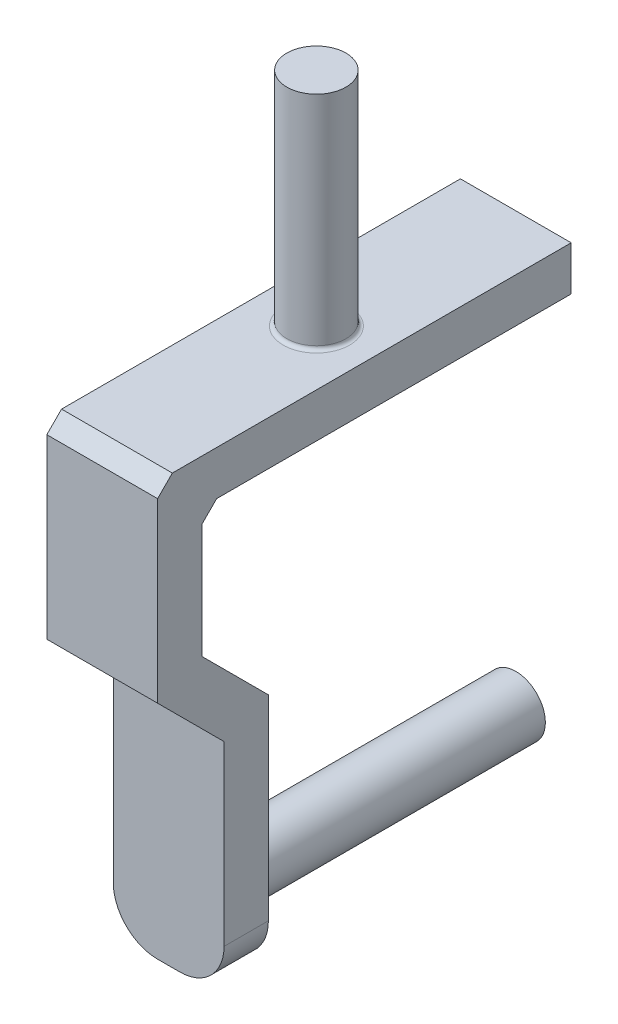
ISO-10303-21;
HEADER;
FILE_DESCRIPTION(('STEP AP214'),'2;1');
FILE_NAME('part.step','',(''),(''),'','','');
FILE_SCHEMA(('AUTOMOTIVE_DESIGN { 1 0 10303 214 1 1 1 1 }'));
ENDSEC;
DATA;
#1=APPLICATION_CONTEXT('core data for automotive mechanical design processes');
#2=APPLICATION_PROTOCOL_DEFINITION('international standard','automotive_design',2000,#1);
#3=PRODUCT_CONTEXT('',#1,'mechanical');
#4=PRODUCT('Part','Part','',(#3));
#5=PRODUCT_RELATED_PRODUCT_CATEGORY('part','',(#4));
#6=PRODUCT_DEFINITION_FORMATION('','',#4);
#7=PRODUCT_DEFINITION_CONTEXT('part definition',#1,'design');
#8=PRODUCT_DEFINITION('design','',#6,#7);
#9=PRODUCT_DEFINITION_SHAPE('','',#8);
#10=(LENGTH_UNIT() NAMED_UNIT(*) SI_UNIT(.MILLI.,.METRE.));
#11=(NAMED_UNIT(*) PLANE_ANGLE_UNIT() SI_UNIT($,.RADIAN.));
#12=(NAMED_UNIT(*) SI_UNIT($,.STERADIAN.) SOLID_ANGLE_UNIT());
#13=UNCERTAINTY_MEASURE_WITH_UNIT(LENGTH_MEASURE(1.E-05),#10,'distance_accuracy_value','');
#14=(GEOMETRIC_REPRESENTATION_CONTEXT(3) GLOBAL_UNCERTAINTY_ASSIGNED_CONTEXT((#13)) GLOBAL_UNIT_ASSIGNED_CONTEXT((#10,
#11,#12)) REPRESENTATION_CONTEXT('',''));
#15=CARTESIAN_POINT('',(0.,0.,0.));
#16=DIRECTION('',(0.,0.,1.));
#17=DIRECTION('',(1.,0.,0.));
#18=AXIS2_PLACEMENT_3D('',#15,#16,#17);
#19=CARTESIAN_POINT('',(-7.5,32.5,6.));
#20=DIRECTION('',(0.,-1.,0.));
#21=DIRECTION('',(0.,0.,-1.));
#22=AXIS2_PLACEMENT_3D('',#19,#20,#21);
#23=PLANE('',#22);
#24=CARTESIAN_POINT('',(0.,32.5,-23.));
#25=DIRECTION('',(0.,-1.,0.));
#26=DIRECTION('',(0.,0.,-1.));
#27=AXIS2_PLACEMENT_3D('',#24,#25,#26);
#28=CIRCLE('',#27,4.5);
#29=CARTESIAN_POINT('',(0.,32.5,-27.5));
#30=VERTEX_POINT('',#29);
#31=EDGE_CURVE('E249',#30,#30,#28,.T.);
#32=ORIENTED_EDGE('',*,*,#31,.T.);
#33=EDGE_LOOP('',(#32));
#34=FACE_BOUND('',#33,.T.);
#35=DIRECTION('',(0.,0.,-1.));
#36=VECTOR('',#35,1.);
#37=CARTESIAN_POINT('',(-7.5,32.5,6.));
#38=LINE('',#37,#36);
#39=CARTESIAN_POINT('',(-7.5,32.5,3.99999999999999));
#40=VERTEX_POINT('',#39);
#41=CARTESIAN_POINT('',(-7.5,32.5,-50.));
#42=VERTEX_POINT('',#41);
#43=EDGE_CURVE('E208',#40,#42,#38,.T.);
#44=ORIENTED_EDGE('',*,*,#43,.F.);
#45=DIRECTION('',(1.,0.,0.));
#46=VECTOR('',#45,1.);
#47=CARTESIAN_POINT('',(7.5,32.5,3.99999999999999));
#48=LINE('',#47,#46);
#49=CARTESIAN_POINT('',(7.5,32.5,3.99999999999999));
#50=VERTEX_POINT('',#49);
#51=EDGE_CURVE('E223',#40,#50,#48,.T.);
#52=ORIENTED_EDGE('',*,*,#51,.T.);
#53=DIRECTION('',(0.,0.,-1.));
#54=VECTOR('',#53,1.);
#55=CARTESIAN_POINT('',(7.5,32.5,6.));
#56=LINE('',#55,#54);
#57=CARTESIAN_POINT('',(7.5,32.5,-50.));
#58=VERTEX_POINT('',#57);
#59=EDGE_CURVE('E304',#50,#58,#56,.T.);
#60=ORIENTED_EDGE('',*,*,#59,.T.);
#61=DIRECTION('',(1.,0.,0.));
#62=VECTOR('',#61,1.);
#63=CARTESIAN_POINT('',(-7.5,32.5,-50.));
#64=LINE('',#63,#62);
#65=EDGE_CURVE('E195',#42,#58,#64,.T.);
#66=ORIENTED_EDGE('',*,*,#65,.F.);
#67=EDGE_LOOP('',(#44,#52,#60,#66));
#68=FACE_BOUND('',#67,.T.);
#69=ADVANCED_FACE('F35',(#34,#68),#23,.F.);
#70=CARTESIAN_POINT('',(-7.5,-32.5,0.));
#71=DIRECTION('',(0.,0.,1.));
#72=DIRECTION('',(1.,0.,0.));
#73=AXIS2_PLACEMENT_3D('',#70,#71,#72);
#74=PLANE('',#73);
#75=DIRECTION('',(0.,1.,0.));
#76=VECTOR('',#75,1.);
#77=CARTESIAN_POINT('',(7.5,32.5,0.));
#78=LINE('',#77,#76);
#79=CARTESIAN_POINT('',(7.5,9.00000000000006,0.));
#80=VERTEX_POINT('',#79);
#81=CARTESIAN_POINT('',(7.5,24.5,0.));
#82=VERTEX_POINT('',#81);
#83=EDGE_CURVE('E206',#80,#82,#78,.T.);
#84=ORIENTED_EDGE('',*,*,#83,.F.);
#85=DIRECTION('',(-1.,0.,0.));
#86=VECTOR('',#85,1.);
#87=CARTESIAN_POINT('',(-7.49999999999998,9.00000000000007,0.));
#88=LINE('',#87,#86);
#89=CARTESIAN_POINT('',(-7.5,9.00000000000007,0.));
#90=VERTEX_POINT('',#89);
#91=EDGE_CURVE('E252',#80,#90,#88,.T.);
#92=ORIENTED_EDGE('',*,*,#91,.T.);
#93=DIRECTION('',(0.,-1.,0.));
#94=VECTOR('',#93,1.);
#95=CARTESIAN_POINT('',(-7.5,32.5,0.));
#96=LINE('',#95,#94);
#97=CARTESIAN_POINT('',(-7.5,24.5,0.));
#98=VERTEX_POINT('',#97);
#99=EDGE_CURVE('E214',#98,#90,#96,.T.);
#100=ORIENTED_EDGE('',*,*,#99,.F.);
#101=DIRECTION('',(1.,0.,0.));
#102=VECTOR('',#101,1.);
#103=CARTESIAN_POINT('',(7.5,24.5,0.));
#104=LINE('',#103,#102);
#105=EDGE_CURVE('E231',#98,#82,#104,.T.);
#106=ORIENTED_EDGE('',*,*,#105,.T.);
#107=EDGE_LOOP('',(#84,#92,#100,#106));
#108=FACE_BOUND('',#107,.T.);
#109=ADVANCED_FACE('F282',(#108),#74,.F.);
#110=CARTESIAN_POINT('',(-7.5,32.5,6.));
#111=DIRECTION('',(1.,0.,0.));
#112=DIRECTION('',(0.,1.,0.));
#113=AXIS2_PLACEMENT_3D('',#110,#111,#112);
#114=PLANE('',#113);
#115=DIRECTION('',(0.,1.,0.));
#116=VECTOR('',#115,1.);
#117=CARTESIAN_POINT('',(-7.5,-2.48528137423857,-3.));
#118=LINE('',#117,#116);
#119=CARTESIAN_POINT('',(-7.5,-26.5,-3.));
#120=VERTEX_POINT('',#119);
#121=CARTESIAN_POINT('',(-7.5,-2.48528137423857,-3.));
#122=VERTEX_POINT('',#121);
#123=EDGE_CURVE('E139',#120,#122,#118,.T.);
#124=ORIENTED_EDGE('',*,*,#123,.T.);
#125=DIRECTION('',(0.,0.707106781186548,0.707106781186547));
#126=VECTOR('',#125,1.);
#127=CARTESIAN_POINT('',(-7.5,6.51471862576143,6.));
#128=LINE('',#127,#126);
#129=CARTESIAN_POINT('',(-7.5,6.51471862576143,6.));
#130=VERTEX_POINT('',#129);
#131=EDGE_CURVE('E148',#122,#130,#128,.T.);
#132=ORIENTED_EDGE('',*,*,#131,.T.);
#133=DIRECTION('',(0.,-1.,0.));
#134=VECTOR('',#133,1.);
#135=CARTESIAN_POINT('',(-7.5,32.5,6.));
#136=LINE('',#135,#134);
#137=CARTESIAN_POINT('',(-7.5,30.5,6.));
#138=VERTEX_POINT('',#137);
#139=EDGE_CURVE('E203',#138,#130,#136,.T.);
#140=ORIENTED_EDGE('',*,*,#139,.F.);
#141=DIRECTION('',(0.,0.707106781186546,-0.707106781186549));
#142=VECTOR('',#141,1.);
#143=CARTESIAN_POINT('',(-7.5,30.5,6.));
#144=LINE('',#143,#142);
#145=EDGE_CURVE('E221',#138,#40,#144,.T.);
#146=ORIENTED_EDGE('',*,*,#145,.T.);
#147=ORIENTED_EDGE('',*,*,#43,.T.);
#148=DIRECTION('',(0.,1.,0.));
#149=VECTOR('',#148,1.);
#150=CARTESIAN_POINT('',(-7.5,32.5,-50.));
#151=LINE('',#150,#149);
#152=CARTESIAN_POINT('',(-7.50000000000001,26.5,-50.));
#153=VERTEX_POINT('',#152);
#154=EDGE_CURVE('E192',#153,#42,#151,.T.);
#155=ORIENTED_EDGE('',*,*,#154,.F.);
#156=DIRECTION('',(0.,0.,1.));
#157=VECTOR('',#156,1.);
#158=CARTESIAN_POINT('',(-7.50000000000001,26.5,-50.));
#159=LINE('',#158,#157);
#160=CARTESIAN_POINT('',(-7.50000000000001,26.5,-2.00000000000002));
#161=VERTEX_POINT('',#160);
#162=EDGE_CURVE('E202',#153,#161,#159,.T.);
#163=ORIENTED_EDGE('',*,*,#162,.T.);
#164=DIRECTION('',(0.,0.707106781186544,-0.707106781186551));
#165=VECTOR('',#164,1.);
#166=CARTESIAN_POINT('',(-7.5,25.4999999999999,-0.999999999999966));
#167=LINE('',#166,#165);
#168=EDGE_CURVE('E234',#161,#98,#167,.F.);
#169=ORIENTED_EDGE('',*,*,#168,.T.);
#170=ORIENTED_EDGE('',*,*,#99,.T.);
#171=DIRECTION('',(0.,-0.707106781186552,-0.707106781186543));
#172=VECTOR('',#171,1.);
#173=CARTESIAN_POINT('',(-7.5,23.7500000000002,14.7499999999999));
#174=LINE('',#173,#172);
#175=CARTESIAN_POINT('',(-7.5,0.,-9.));
#176=VERTEX_POINT('',#175);
#177=EDGE_CURVE('E256',#90,#176,#174,.T.);
#178=ORIENTED_EDGE('',*,*,#177,.T.);
#179=DIRECTION('',(0.,-1.,0.));
#180=VECTOR('',#179,1.);
#181=CARTESIAN_POINT('',(-7.5,0.,-9.));
#182=LINE('',#181,#180);
#183=CARTESIAN_POINT('',(-7.5,-26.5,-9.));
#184=VERTEX_POINT('',#183);
#185=EDGE_CURVE('E184',#176,#184,#182,.T.);
#186=ORIENTED_EDGE('',*,*,#185,.T.);
#187=DIRECTION('',(0.,0.,-1.));
#188=VECTOR('',#187,1.);
#189=CARTESIAN_POINT('',(-7.5,-26.5,6.));
#190=LINE('',#189,#188);
#191=EDGE_CURVE('E158',#184,#120,#190,.F.);
#192=ORIENTED_EDGE('',*,*,#191,.T.);
#193=EDGE_LOOP('',(#124,#132,#140,#146,#147,#155,#163,#169,#170,#178,#186,#192));
#194=FACE_BOUND('',#193,.T.);
#195=ADVANCED_FACE('F156',(#194),#114,.F.);
#196=CARTESIAN_POINT('',(-7.5,-32.5,6.));
#197=DIRECTION('',(0.,1.,0.));
#198=DIRECTION('',(0.,0.,1.));
#199=AXIS2_PLACEMENT_3D('',#196,#197,#198);
#200=PLANE('',#199);
#201=DIRECTION('',(0.,0.,-1.));
#202=VECTOR('',#201,1.);
#203=CARTESIAN_POINT('',(1.5,-32.5,6.));
#204=LINE('',#203,#202);
#205=CARTESIAN_POINT('',(1.5,-32.5,-9.));
#206=VERTEX_POINT('',#205);
#207=CARTESIAN_POINT('',(1.5,-32.5,-3.));
#208=VERTEX_POINT('',#207);
#209=EDGE_CURVE('E238',#206,#208,#204,.F.);
#210=ORIENTED_EDGE('',*,*,#209,.T.);
#211=DIRECTION('',(1.,0.,0.));
#212=VECTOR('',#211,1.);
#213=CARTESIAN_POINT('',(-7.5,-32.5,-3.));
#214=LINE('',#213,#212);
#215=CARTESIAN_POINT('',(-1.5,-32.5,-3.));
#216=VERTEX_POINT('',#215);
#217=EDGE_CURVE('E54',#216,#208,#214,.T.);
#218=ORIENTED_EDGE('',*,*,#217,.F.);
#219=DIRECTION('',(0.,0.,-1.));
#220=VECTOR('',#219,1.);
#221=CARTESIAN_POINT('',(-1.5,-32.5,6.));
#222=LINE('',#221,#220);
#223=CARTESIAN_POINT('',(-1.5,-32.5,-9.));
#224=VERTEX_POINT('',#223);
#225=EDGE_CURVE('E241',#216,#224,#222,.T.);
#226=ORIENTED_EDGE('',*,*,#225,.T.);
#227=DIRECTION('',(1.,0.,0.));
#228=VECTOR('',#227,1.);
#229=CARTESIAN_POINT('',(-1.5,-32.5,-9.));
#230=LINE('',#229,#228);
#231=CARTESIAN_POINT('',(0.,-32.5,-9.));
#232=VERTEX_POINT('',#231);
#233=EDGE_CURVE('E172',#224,#232,#230,.T.);
#234=ORIENTED_EDGE('',*,*,#233,.T.);
#235=EDGE_CURVE('E171',#232,#206,#230,.T.);
#236=ORIENTED_EDGE('',*,*,#235,.T.);
#237=EDGE_LOOP('',(#210,#218,#226,#234,#236));
#238=FACE_BOUND('',#237,.T.);
#239=ADVANCED_FACE('F270',(#238),#200,.F.);
#240=CARTESIAN_POINT('',(7.5,32.5,6.));
#241=DIRECTION('',(-1.,0.,0.));
#242=DIRECTION('',(0.,-1.,0.));
#243=AXIS2_PLACEMENT_3D('',#240,#241,#242);
#244=PLANE('',#243);
#245=DIRECTION('',(0.,1.,0.));
#246=VECTOR('',#245,1.);
#247=CARTESIAN_POINT('',(7.5,32.5,6.));
#248=LINE('',#247,#246);
#249=CARTESIAN_POINT('',(7.5,6.51471862576143,6.));
#250=VERTEX_POINT('',#249);
#251=CARTESIAN_POINT('',(7.5,30.5,6.));
#252=VERTEX_POINT('',#251);
#253=EDGE_CURVE('E205',#250,#252,#248,.T.);
#254=ORIENTED_EDGE('',*,*,#253,.F.);
#255=DIRECTION('',(0.,0.707106781186548,0.707106781186547));
#256=VECTOR('',#255,1.);
#257=CARTESIAN_POINT('',(7.5,6.51471862576143,6.));
#258=LINE('',#257,#256);
#259=CARTESIAN_POINT('',(7.5,-2.48528137423857,-3.));
#260=VERTEX_POINT('',#259);
#261=EDGE_CURVE('E159',#260,#250,#258,.T.);
#262=ORIENTED_EDGE('',*,*,#261,.F.);
#263=DIRECTION('',(0.,1.,0.));
#264=VECTOR('',#263,1.);
#265=CARTESIAN_POINT('',(7.5,-2.48528137423857,-3.));
#266=LINE('',#265,#264);
#267=CARTESIAN_POINT('',(7.5,-26.5,-3.));
#268=VERTEX_POINT('',#267);
#269=EDGE_CURVE('E142',#268,#260,#266,.T.);
#270=ORIENTED_EDGE('',*,*,#269,.F.);
#271=DIRECTION('',(0.,0.,-1.));
#272=VECTOR('',#271,1.);
#273=CARTESIAN_POINT('',(7.5,-26.5,6.));
#274=LINE('',#273,#272);
#275=CARTESIAN_POINT('',(7.5,-26.5,-9.));
#276=VERTEX_POINT('',#275);
#277=EDGE_CURVE('E244',#268,#276,#274,.T.);
#278=ORIENTED_EDGE('',*,*,#277,.T.);
#279=DIRECTION('',(0.,1.,0.));
#280=VECTOR('',#279,1.);
#281=CARTESIAN_POINT('',(7.5,-26.5,-9.));
#282=LINE('',#281,#280);
#283=CARTESIAN_POINT('',(7.5,0.,-9.));
#284=VERTEX_POINT('',#283);
#285=EDGE_CURVE('E178',#276,#284,#282,.T.);
#286=ORIENTED_EDGE('',*,*,#285,.T.);
#287=DIRECTION('',(0.,0.707106781186552,0.707106781186543));
#288=VECTOR('',#287,1.);
#289=CARTESIAN_POINT('',(7.5,23.7500000000002,14.7499999999999));
#290=LINE('',#289,#288);
#291=EDGE_CURVE('E258',#284,#80,#290,.T.);
#292=ORIENTED_EDGE('',*,*,#291,.T.);
#293=ORIENTED_EDGE('',*,*,#83,.T.);
#294=DIRECTION('',(0.,-0.707106781186544,0.707106781186551));
#295=VECTOR('',#294,1.);
#296=CARTESIAN_POINT('',(7.5,25.4999999999999,-0.999999999999966));
#297=LINE('',#296,#295);
#298=CARTESIAN_POINT('',(7.5,26.5,-2.00000000000002));
#299=VERTEX_POINT('',#298);
#300=EDGE_CURVE('E236',#82,#299,#297,.F.);
#301=ORIENTED_EDGE('',*,*,#300,.T.);
#302=DIRECTION('',(0.,0.,1.));
#303=VECTOR('',#302,1.);
#304=CARTESIAN_POINT('',(7.5,26.5,-50.));
#305=LINE('',#304,#303);
#306=CARTESIAN_POINT('',(7.5,26.5,-50.));
#307=VERTEX_POINT('',#306);
#308=EDGE_CURVE('E218',#307,#299,#305,.T.);
#309=ORIENTED_EDGE('',*,*,#308,.F.);
#310=DIRECTION('',(0.,-1.,0.));
#311=VECTOR('',#310,1.);
#312=CARTESIAN_POINT('',(7.5,32.5,-50.));
#313=LINE('',#312,#311);
#314=EDGE_CURVE('E198',#58,#307,#313,.T.);
#315=ORIENTED_EDGE('',*,*,#314,.F.);
#316=ORIENTED_EDGE('',*,*,#59,.F.);
#317=DIRECTION('',(0.,-0.707106781186546,0.707106781186549));
#318=VECTOR('',#317,1.);
#319=CARTESIAN_POINT('',(7.5,30.5,6.));
#320=LINE('',#319,#318);
#321=EDGE_CURVE('E225',#50,#252,#320,.T.);
#322=ORIENTED_EDGE('',*,*,#321,.T.);
#323=EDGE_LOOP('',(#254,#262,#270,#278,#286,#292,#293,#301,#309,#315,#316,#322));
#324=FACE_BOUND('',#323,.T.);
#325=ADVANCED_FACE('F287',(#324),#244,.F.);
#326=CARTESIAN_POINT('',(-7.5,-32.5,6.));
#327=DIRECTION('',(0.,0.,1.));
#328=DIRECTION('',(1.,0.,0.));
#329=AXIS2_PLACEMENT_3D('',#326,#327,#328);
#330=PLANE('',#329);
#331=DIRECTION('',(1.,0.,0.));
#332=VECTOR('',#331,1.);
#333=CARTESIAN_POINT('',(-7.5,6.51471862576143,6.));
#334=LINE('',#333,#332);
#335=EDGE_CURVE('E145',#130,#250,#334,.T.);
#336=ORIENTED_EDGE('',*,*,#335,.T.);
#337=ORIENTED_EDGE('',*,*,#253,.T.);
#338=DIRECTION('',(-1.,0.,0.));
#339=VECTOR('',#338,1.);
#340=CARTESIAN_POINT('',(-7.5,30.5,6.));
#341=LINE('',#340,#339);
#342=EDGE_CURVE('E219',#252,#138,#341,.T.);
#343=ORIENTED_EDGE('',*,*,#342,.T.);
#344=ORIENTED_EDGE('',*,*,#139,.T.);
#345=EDGE_LOOP('',(#336,#337,#343,#344));
#346=FACE_BOUND('',#345,.T.);
#347=ADVANCED_FACE('F294',(#346),#330,.T.);
#348=CARTESIAN_POINT('',(-7.50000000000001,26.5,-50.));
#349=DIRECTION('',(0.,1.,0.));
#350=DIRECTION('',(0.,0.,1.));
#351=AXIS2_PLACEMENT_3D('',#348,#349,#350);
#352=PLANE('',#351);
#353=ORIENTED_EDGE('',*,*,#308,.T.);
#354=DIRECTION('',(-1.,0.,0.));
#355=VECTOR('',#354,1.);
#356=CARTESIAN_POINT('',(-7.50000000000001,26.5,-2.00000000000002));
#357=LINE('',#356,#355);
#358=EDGE_CURVE('E228',#299,#161,#357,.T.);
#359=ORIENTED_EDGE('',*,*,#358,.T.);
#360=ORIENTED_EDGE('',*,*,#162,.F.);
#361=DIRECTION('',(-1.,0.,0.));
#362=VECTOR('',#361,1.);
#363=CARTESIAN_POINT('',(-7.50000000000001,26.5,-50.));
#364=LINE('',#363,#362);
#365=EDGE_CURVE('E200',#307,#153,#364,.T.);
#366=ORIENTED_EDGE('',*,*,#365,.F.);
#367=EDGE_LOOP('',(#353,#359,#360,#366));
#368=FACE_BOUND('',#367,.T.);
#369=ADVANCED_FACE('F318',(#368),#352,.F.);
#370=CARTESIAN_POINT('',(-7.50000000000001,26.5,-50.));
#371=DIRECTION('',(0.,0.,1.));
#372=DIRECTION('',(1.,0.,0.));
#373=AXIS2_PLACEMENT_3D('',#370,#371,#372);
#374=PLANE('',#373);
#375=ORIENTED_EDGE('',*,*,#154,.T.);
#376=ORIENTED_EDGE('',*,*,#65,.T.);
#377=ORIENTED_EDGE('',*,*,#314,.T.);
#378=ORIENTED_EDGE('',*,*,#365,.T.);
#379=EDGE_LOOP('',(#375,#376,#377,#378));
#380=FACE_BOUND('',#379,.T.);
#381=ADVANCED_FACE('F323',(#380),#374,.F.);
#382=CARTESIAN_POINT('',(-7.5,30.5,6.));
#383=DIRECTION('',(0.,0.707106781186549,0.707106781186546));
#384=DIRECTION('',(0.,-0.707106781186546,0.707106781186549));
#385=AXIS2_PLACEMENT_3D('',#382,#383,#384);
#386=PLANE('',#385);
#387=ORIENTED_EDGE('',*,*,#321,.F.);
#388=ORIENTED_EDGE('',*,*,#51,.F.);
#389=ORIENTED_EDGE('',*,*,#145,.F.);
#390=ORIENTED_EDGE('',*,*,#342,.F.);
#391=EDGE_LOOP('',(#387,#388,#389,#390));
#392=FACE_BOUND('',#391,.T.);
#393=ADVANCED_FACE('F306',(#392),#386,.T.);
#394=CARTESIAN_POINT('',(-7.50000000000001,26.5,-2.00000000000002));
#395=DIRECTION('',(0.,-0.707106781186551,-0.707106781186544));
#396=DIRECTION('',(0.,0.707106781186544,-0.707106781186551));
#397=AXIS2_PLACEMENT_3D('',#394,#395,#396);
#398=PLANE('',#397);
#399=ORIENTED_EDGE('',*,*,#300,.F.);
#400=ORIENTED_EDGE('',*,*,#105,.F.);
#401=ORIENTED_EDGE('',*,*,#168,.F.);
#402=ORIENTED_EDGE('',*,*,#358,.F.);
#403=EDGE_LOOP('',(#399,#400,#401,#402));
#404=FACE_BOUND('',#403,.T.);
#405=ADVANCED_FACE('F321',(#404),#398,.T.);
#406=CARTESIAN_POINT('',(-1.5,-26.5,6.));
#407=DIRECTION('',(0.,0.,-1.));
#408=DIRECTION('',(-1.,0.,0.));
#409=AXIS2_PLACEMENT_3D('',#406,#407,#408);
#410=CYLINDRICAL_SURFACE('',#409,6.);
#411=CARTESIAN_POINT('',(-1.5,-26.5,-3.));
#412=DIRECTION('',(0.,0.,-1.));
#413=DIRECTION('',(0.,1.,0.));
#414=AXIS2_PLACEMENT_3D('',#411,#412,#413);
#415=CIRCLE('',#414,6.);
#416=EDGE_CURVE('E164',#120,#216,#415,.F.);
#417=ORIENTED_EDGE('',*,*,#416,.F.);
#418=ORIENTED_EDGE('',*,*,#191,.F.);
#419=CARTESIAN_POINT('',(-1.5,-26.5,-9.));
#420=DIRECTION('',(0.,0.,1.));
#421=DIRECTION('',(1.,0.,0.));
#422=AXIS2_PLACEMENT_3D('',#419,#420,#421);
#423=CIRCLE('',#422,6.);
#424=EDGE_CURVE('E168',#184,#224,#423,.T.);
#425=ORIENTED_EDGE('',*,*,#424,.T.);
#426=ORIENTED_EDGE('',*,*,#225,.F.);
#427=EDGE_LOOP('',(#417,#418,#425,#426));
#428=FACE_BOUND('',#427,.T.);
#429=ADVANCED_FACE('F273',(#428),#410,.T.);
#430=CARTESIAN_POINT('',(1.5,-26.5,6.));
#431=DIRECTION('',(0.,0.,-1.));
#432=DIRECTION('',(-1.,0.,0.));
#433=AXIS2_PLACEMENT_3D('',#430,#431,#432);
#434=CYLINDRICAL_SURFACE('',#433,6.);
#435=CARTESIAN_POINT('',(1.5,-26.5,-3.));
#436=DIRECTION('',(0.,0.,-1.));
#437=DIRECTION('',(0.,1.,0.));
#438=AXIS2_PLACEMENT_3D('',#435,#436,#437);
#439=CIRCLE('',#438,6.);
#440=EDGE_CURVE('E260',#208,#268,#439,.F.);
#441=ORIENTED_EDGE('',*,*,#440,.F.);
#442=ORIENTED_EDGE('',*,*,#209,.F.);
#443=CARTESIAN_POINT('',(1.5,-26.5,-9.));
#444=DIRECTION('',(0.,0.,1.));
#445=DIRECTION('',(1.,0.,0.));
#446=AXIS2_PLACEMENT_3D('',#443,#444,#445);
#447=CIRCLE('',#446,6.);
#448=EDGE_CURVE('E175',#206,#276,#447,.T.);
#449=ORIENTED_EDGE('',*,*,#448,.T.);
#450=ORIENTED_EDGE('',*,*,#277,.F.);
#451=EDGE_LOOP('',(#441,#442,#449,#450));
#452=FACE_BOUND('',#451,.T.);
#453=ADVANCED_FACE('F292',(#452),#434,.T.);
#454=CARTESIAN_POINT('',(0.,62.5,-23.));
#455=DIRECTION('',(0.,-1.,0.));
#456=DIRECTION('',(0.,0.,-1.));
#457=AXIS2_PLACEMENT_3D('',#454,#455,#456);
#458=CYLINDRICAL_SURFACE('',#457,4.);
#459=CARTESIAN_POINT('',(0.,33.,-23.));
#460=DIRECTION('',(0.,-1.,0.));
#461=DIRECTION('',(0.,0.,-1.));
#462=AXIS2_PLACEMENT_3D('',#459,#460,#461);
#463=CIRCLE('',#462,4.);
#464=CARTESIAN_POINT('',(0.,33.,-27.));
#465=VERTEX_POINT('',#464);
#466=EDGE_CURVE('E246',#465,#465,#463,.F.);
#467=ORIENTED_EDGE('',*,*,#466,.T.);
#468=EDGE_LOOP('',(#467));
#469=FACE_BOUND('',#468,.T.);
#470=CARTESIAN_POINT('',(0.,62.5,-23.));
#471=DIRECTION('',(0.,1.,0.));
#472=DIRECTION('',(0.,0.,1.));
#473=AXIS2_PLACEMENT_3D('',#470,#471,#472);
#474=CIRCLE('',#473,4.);
#475=CARTESIAN_POINT('',(0.,62.5,-19.));
#476=VERTEX_POINT('',#475);
#477=EDGE_CURVE('E186',#476,#476,#474,.T.);
#478=ORIENTED_EDGE('',*,*,#477,.F.);
#479=EDGE_LOOP('',(#478));
#480=FACE_BOUND('',#479,.T.);
#481=ADVANCED_FACE('F354',(#469,#480),#458,.T.);
#482=CARTESIAN_POINT('',(0.,62.5,-23.));
#483=DIRECTION('',(0.,1.,0.));
#484=DIRECTION('',(0.,0.,1.));
#485=AXIS2_PLACEMENT_3D('',#482,#483,#484);
#486=PLANE('',#485);
#487=ORIENTED_EDGE('',*,*,#477,.T.);
#488=EDGE_LOOP('',(#487));
#489=FACE_BOUND('',#488,.T.);
#490=ADVANCED_FACE('F357',(#489),#486,.T.);
#491=CARTESIAN_POINT('',(0.,33.,-23.));
#492=DIRECTION('',(0.,-1.,0.));
#493=DIRECTION('',(0.,0.,-1.));
#494=AXIS2_PLACEMENT_3D('',#491,#492,#493);
#495=TOROIDAL_SURFACE('',#494,4.5,0.5);
#496=ORIENTED_EDGE('',*,*,#31,.F.);
#497=EDGE_LOOP('',(#496));
#498=FACE_BOUND('',#497,.T.);
#499=ORIENTED_EDGE('',*,*,#466,.F.);
#500=EDGE_LOOP('',(#499));
#501=FACE_BOUND('',#500,.T.);
#502=ADVANCED_FACE('F355',(#498,#501),#495,.F.);
#503=CARTESIAN_POINT('',(-1.5,-26.5,-9.));
#504=DIRECTION('',(0.,0.,1.));
#505=DIRECTION('',(1.,0.,0.));
#506=AXIS2_PLACEMENT_3D('',#503,#504,#505);
#507=PLANE('',#506);
#508=ORIENTED_EDGE('',*,*,#235,.F.);
#509=CARTESIAN_POINT('',(0.,-25.5,-9.));
#510=DIRECTION('',(0.,0.,1.));
#511=DIRECTION('',(1.,0.,0.));
#512=AXIS2_PLACEMENT_3D('',#509,#510,#511);
#513=CIRCLE('',#512,7.00000000000002);
#514=EDGE_CURVE('E43',#232,#232,#513,.T.);
#515=ORIENTED_EDGE('',*,*,#514,.T.);
#516=ORIENTED_EDGE('',*,*,#233,.F.);
#517=ORIENTED_EDGE('',*,*,#424,.F.);
#518=ORIENTED_EDGE('',*,*,#185,.F.);
#519=DIRECTION('',(-1.,0.,0.));
#520=VECTOR('',#519,1.);
#521=CARTESIAN_POINT('',(7.5,0.,-9.));
#522=LINE('',#521,#520);
#523=EDGE_CURVE('E181',#284,#176,#522,.T.);
#524=ORIENTED_EDGE('',*,*,#523,.F.);
#525=ORIENTED_EDGE('',*,*,#285,.F.);
#526=ORIENTED_EDGE('',*,*,#448,.F.);
#527=EDGE_LOOP('',(#508,#515,#516,#517,#518,#524,#525,#526));
#528=FACE_BOUND('',#527,.T.);
#529=ADVANCED_FACE('F264',(#528),#507,.F.);
#530=CARTESIAN_POINT('',(0.,-25.5,-50.));
#531=DIRECTION('',(0.,0.,-1.));
#532=DIRECTION('',(-1.,0.,0.));
#533=AXIS2_PLACEMENT_3D('',#530,#531,#532);
#534=PLANE('',#533);
#535=CARTESIAN_POINT('',(0.,-25.5,-50.));
#536=DIRECTION('',(0.,0.,-1.));
#537=DIRECTION('',(-1.,0.,0.));
#538=AXIS2_PLACEMENT_3D('',#535,#536,#537);
#539=CIRCLE('',#538,4.);
#540=CARTESIAN_POINT('',(-4.,-25.5,-50.));
#541=VERTEX_POINT('',#540);
#542=EDGE_CURVE('E189',#541,#541,#539,.T.);
#543=ORIENTED_EDGE('',*,*,#542,.T.);
#544=EDGE_LOOP('',(#543));
#545=FACE_BOUND('',#544,.T.);
#546=ADVANCED_FACE('F366',(#545),#534,.T.);
#547=CARTESIAN_POINT('',(0.,-25.5,-50.));
#548=DIRECTION('',(0.,0.,1.));
#549=DIRECTION('',(1.,0.,0.));
#550=AXIS2_PLACEMENT_3D('',#547,#548,#549);
#551=CYLINDRICAL_SURFACE('',#550,4.);
#552=CARTESIAN_POINT('',(0.,-25.5,-12.));
#553=DIRECTION('',(0.,0.,1.));
#554=DIRECTION('',(1.,0.,0.));
#555=AXIS2_PLACEMENT_3D('',#552,#553,#554);
#556=CIRCLE('',#555,4.);
#557=CARTESIAN_POINT('',(4.,-25.5,-12.));
#558=VERTEX_POINT('',#557);
#559=EDGE_CURVE('E11',#558,#558,#556,.F.);
#560=ORIENTED_EDGE('',*,*,#559,.T.);
#561=EDGE_LOOP('',(#560));
#562=FACE_BOUND('',#561,.T.);
#563=ORIENTED_EDGE('',*,*,#542,.F.);
#564=EDGE_LOOP('',(#563));
#565=FACE_BOUND('',#564,.T.);
#566=ADVANCED_FACE('F360',(#562,#565),#551,.T.);
#567=CARTESIAN_POINT('',(-7.49999999999998,9.00000000000007,0.));
#568=DIRECTION('',(0.,-0.707106781186543,0.707106781186552));
#569=DIRECTION('',(0.,-0.707106781186552,-0.707106781186543));
#570=AXIS2_PLACEMENT_3D('',#567,#568,#569);
#571=PLANE('',#570);
#572=ORIENTED_EDGE('',*,*,#291,.F.);
#573=ORIENTED_EDGE('',*,*,#523,.T.);
#574=ORIENTED_EDGE('',*,*,#177,.F.);
#575=ORIENTED_EDGE('',*,*,#91,.F.);
#576=EDGE_LOOP('',(#572,#573,#574,#575));
#577=FACE_BOUND('',#576,.T.);
#578=ADVANCED_FACE('F279',(#577),#571,.F.);
#579=CARTESIAN_POINT('',(-7.5,6.51471862576143,6.));
#580=DIRECTION('',(0.,0.707106781186547,-0.707106781186548));
#581=DIRECTION('',(0.,0.707106781186548,0.707106781186547));
#582=AXIS2_PLACEMENT_3D('',#579,#580,#581);
#583=PLANE('',#582);
#584=ORIENTED_EDGE('',*,*,#261,.T.);
#585=ORIENTED_EDGE('',*,*,#335,.F.);
#586=ORIENTED_EDGE('',*,*,#131,.F.);
#587=DIRECTION('',(1.,0.,0.));
#588=VECTOR('',#587,1.);
#589=CARTESIAN_POINT('',(-7.5,-2.48528137423857,-3.));
#590=LINE('',#589,#588);
#591=EDGE_CURVE('E135',#122,#260,#590,.T.);
#592=ORIENTED_EDGE('',*,*,#591,.T.);
#593=EDGE_LOOP('',(#584,#585,#586,#592));
#594=FACE_BOUND('',#593,.T.);
#595=ADVANCED_FACE('F149',(#594),#583,.F.);
#596=CARTESIAN_POINT('',(-7.5,-2.48528137423857,-3.));
#597=DIRECTION('',(0.,0.,-1.));
#598=DIRECTION('',(0.,1.,0.));
#599=AXIS2_PLACEMENT_3D('',#596,#597,#598);
#600=PLANE('',#599);
#601=ORIENTED_EDGE('',*,*,#416,.T.);
#602=ORIENTED_EDGE('',*,*,#217,.T.);
#603=ORIENTED_EDGE('',*,*,#440,.T.);
#604=ORIENTED_EDGE('',*,*,#269,.T.);
#605=ORIENTED_EDGE('',*,*,#591,.F.);
#606=ORIENTED_EDGE('',*,*,#123,.F.);
#607=EDGE_LOOP('',(#601,#602,#603,#604,#605,#606));
#608=FACE_BOUND('',#607,.T.);
#609=ADVANCED_FACE('F137',(#608),#600,.F.);
#610=CARTESIAN_POINT('',(0.,-25.5,-9.));
#611=DIRECTION('',(0.,0.,1.));
#612=DIRECTION('',(1.,0.,0.));
#613=AXIS2_PLACEMENT_3D('',#610,#611,#612);
#614=CONICAL_SURFACE('',#613,7.00000000000002,0.785398163397456);
#615=ORIENTED_EDGE('',*,*,#559,.F.);
#616=EDGE_LOOP('',(#615));
#617=FACE_BOUND('',#616,.T.);
#618=ORIENTED_EDGE('',*,*,#514,.F.);
#619=EDGE_LOOP('',(#618));
#620=FACE_BOUND('',#619,.T.);
#621=ADVANCED_FACE('F37',(#617,#620),#614,.T.);
#622=CLOSED_SHELL('',(#69,#109,#195,#239,#325,#347,#369,#381,#393,#405,#429,#453,#481,#490,#502,
#529,#546,#566,#578,#595,#609,#621));
#623=MANIFOLD_SOLID_BREP('B2',#622);
#624=ADVANCED_BREP_SHAPE_REPRESENTATION('',(#18,#623),#14);
#625=SHAPE_DEFINITION_REPRESENTATION(#9,#624);
ENDSEC;
END-ISO-10303-21;
